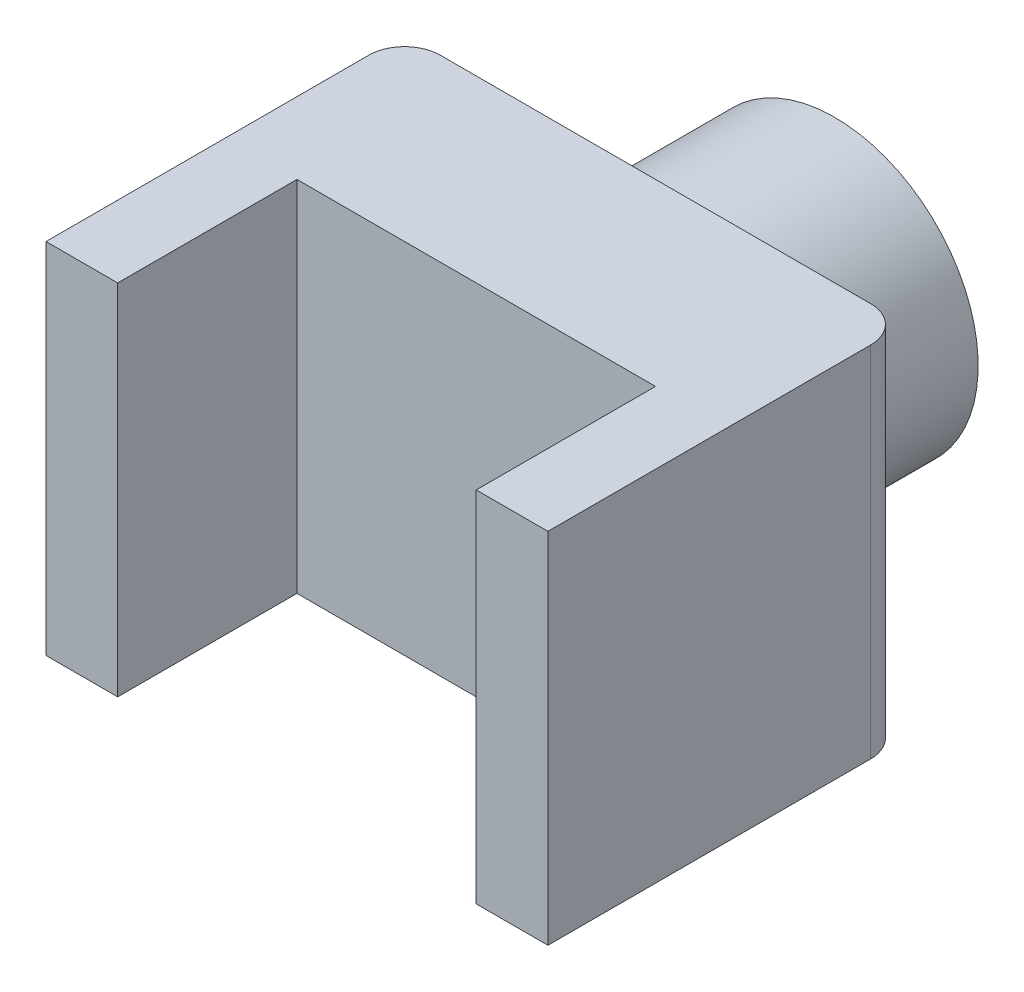
ISO-10303-21;
HEADER;
FILE_DESCRIPTION(('STEP AP214'),'2;1');
FILE_NAME('part.step','',(''),(''),'','','');
FILE_SCHEMA(('AUTOMOTIVE_DESIGN { 1 0 10303 214 1 1 1 1 }'));
ENDSEC;
DATA;
#1=APPLICATION_CONTEXT('core data for automotive mechanical design processes');
#2=APPLICATION_PROTOCOL_DEFINITION('international standard','automotive_design',2000,#1);
#3=PRODUCT_CONTEXT('',#1,'mechanical');
#4=PRODUCT('Part','Part','',(#3));
#5=PRODUCT_RELATED_PRODUCT_CATEGORY('part','',(#4));
#6=PRODUCT_DEFINITION_FORMATION('','',#4);
#7=PRODUCT_DEFINITION_CONTEXT('part definition',#1,'design');
#8=PRODUCT_DEFINITION('design','',#6,#7);
#9=PRODUCT_DEFINITION_SHAPE('','',#8);
#10=(LENGTH_UNIT() NAMED_UNIT(*) SI_UNIT(.MILLI.,.METRE.));
#11=(NAMED_UNIT(*) PLANE_ANGLE_UNIT() SI_UNIT($,.RADIAN.));
#12=(NAMED_UNIT(*) SI_UNIT($,.STERADIAN.) SOLID_ANGLE_UNIT());
#13=UNCERTAINTY_MEASURE_WITH_UNIT(LENGTH_MEASURE(1.E-05),#10,'distance_accuracy_value','');
#14=(GEOMETRIC_REPRESENTATION_CONTEXT(3) GLOBAL_UNCERTAINTY_ASSIGNED_CONTEXT((#13)) GLOBAL_UNIT_ASSIGNED_CONTEXT((#10,
#11,#12)) REPRESENTATION_CONTEXT('',''));
#15=CARTESIAN_POINT('',(0.,0.,0.));
#16=DIRECTION('',(0.,0.,1.));
#17=DIRECTION('',(1.,0.,0.));
#18=AXIS2_PLACEMENT_3D('',#15,#16,#17);
#19=CARTESIAN_POINT('',(0.,0.,10.));
#20=DIRECTION('',(0.,0.,-1.));
#21=DIRECTION('',(-1.,0.,0.));
#22=AXIS2_PLACEMENT_3D('',#19,#20,#21);
#23=PLANE('',#22);
#24=DIRECTION('',(-1.,0.,0.));
#25=VECTOR('',#24,1.);
#26=CARTESIAN_POINT('',(0.,10.,10.));
#27=LINE('',#26,#25);
#28=CARTESIAN_POINT('',(14.,10.,10.));
#29=VERTEX_POINT('',#28);
#30=CARTESIAN_POINT('',(12.,10.,10.));
#31=VERTEX_POINT('',#30);
#32=EDGE_CURVE('E173',#29,#31,#27,.T.);
#33=ORIENTED_EDGE('',*,*,#32,.T.);
#34=DIRECTION('',(0.,1.,0.));
#35=VECTOR('',#34,1.);
#36=CARTESIAN_POINT('',(12.,0.,10.));
#37=LINE('',#36,#35);
#38=CARTESIAN_POINT('',(12.,0.,10.));
#39=VERTEX_POINT('',#38);
#40=EDGE_CURVE('E121',#39,#31,#37,.T.);
#41=ORIENTED_EDGE('',*,*,#40,.F.);
#42=DIRECTION('',(1.,0.,0.));
#43=VECTOR('',#42,1.);
#44=CARTESIAN_POINT('',(0.,0.,10.));
#45=LINE('',#44,#43);
#46=CARTESIAN_POINT('',(14.,0.,10.));
#47=VERTEX_POINT('',#46);
#48=EDGE_CURVE('E165',#39,#47,#45,.T.);
#49=ORIENTED_EDGE('',*,*,#48,.T.);
#50=DIRECTION('',(0.,1.,0.));
#51=VECTOR('',#50,1.);
#52=CARTESIAN_POINT('',(14.,0.,10.));
#53=LINE('',#52,#51);
#54=EDGE_CURVE('E170',#47,#29,#53,.T.);
#55=ORIENTED_EDGE('',*,*,#54,.T.);
#56=EDGE_LOOP('',(#33,#41,#49,#55));
#57=FACE_BOUND('',#56,.T.);
#58=ADVANCED_FACE('F33',(#57),#23,.F.);
#59=CARTESIAN_POINT('',(0.,0.,0.));
#60=DIRECTION('',(0.,0.,-1.));
#61=DIRECTION('',(-1.,0.,0.));
#62=AXIS2_PLACEMENT_3D('',#59,#60,#61);
#63=PLANE('',#62);
#64=DIRECTION('',(-1.,0.,0.));
#65=VECTOR('',#64,1.);
#66=CARTESIAN_POINT('',(0.,10.,0.));
#67=LINE('',#66,#65);
#68=CARTESIAN_POINT('',(13.,10.,0.));
#69=VERTEX_POINT('',#68);
#70=CARTESIAN_POINT('',(7.,10.,0.));
#71=VERTEX_POINT('',#70);
#72=EDGE_CURVE('E166',#69,#71,#67,.T.);
#73=ORIENTED_EDGE('',*,*,#72,.F.);
#74=DIRECTION('',(0.,1.,0.));
#75=VECTOR('',#74,1.);
#76=CARTESIAN_POINT('',(13.,0.,0.));
#77=LINE('',#76,#75);
#78=CARTESIAN_POINT('',(13.,0.,0.));
#79=VERTEX_POINT('',#78);
#80=EDGE_CURVE('E11',#69,#79,#77,.F.);
#81=ORIENTED_EDGE('',*,*,#80,.T.);
#82=DIRECTION('',(1.,0.,0.));
#83=VECTOR('',#82,1.);
#84=CARTESIAN_POINT('',(0.,0.,0.));
#85=LINE('',#84,#83);
#86=CARTESIAN_POINT('',(7.,0.,0.));
#87=VERTEX_POINT('',#86);
#88=EDGE_CURVE('E161',#87,#79,#85,.T.);
#89=ORIENTED_EDGE('',*,*,#88,.F.);
#90=CARTESIAN_POINT('',(7.,5.,0.));
#91=DIRECTION('',(0.,0.,-1.));
#92=DIRECTION('',(-1.,0.,0.));
#93=AXIS2_PLACEMENT_3D('',#90,#91,#92);
#94=CIRCLE('',#93,5.);
#95=EDGE_CURVE('E197',#87,#71,#94,.F.);
#96=ORIENTED_EDGE('',*,*,#95,.T.);
#97=EDGE_LOOP('',(#73,#81,#89,#96));
#98=FACE_BOUND('',#97,.T.);
#99=ADVANCED_FACE('F225',(#98),#63,.T.);
#100=CARTESIAN_POINT('',(0.,0.,10.));
#101=DIRECTION('',(1.,0.,0.));
#102=DIRECTION('',(0.,0.,-1.));
#103=AXIS2_PLACEMENT_3D('',#100,#101,#102);
#104=PLANE('',#103);
#105=DIRECTION('',(0.,0.,-1.));
#106=VECTOR('',#105,1.);
#107=CARTESIAN_POINT('',(0.,10.,10.));
#108=LINE('',#107,#106);
#109=CARTESIAN_POINT('',(0.,10.,10.));
#110=VERTEX_POINT('',#109);
#111=CARTESIAN_POINT('',(0.,10.,0.999999999999999));
#112=VERTEX_POINT('',#111);
#113=EDGE_CURVE('E175',#110,#112,#108,.T.);
#114=ORIENTED_EDGE('',*,*,#113,.T.);
#115=DIRECTION('',(0.,-1.,0.));
#116=VECTOR('',#115,1.);
#117=CARTESIAN_POINT('',(0.,0.,0.999999999999999));
#118=LINE('',#117,#116);
#119=CARTESIAN_POINT('',(0.,0.,0.999999999999999));
#120=VERTEX_POINT('',#119);
#121=EDGE_CURVE('E200',#112,#120,#118,.T.);
#122=ORIENTED_EDGE('',*,*,#121,.T.);
#123=DIRECTION('',(0.,0.,-1.));
#124=VECTOR('',#123,1.);
#125=CARTESIAN_POINT('',(0.,0.,10.));
#126=LINE('',#125,#124);
#127=CARTESIAN_POINT('',(0.,0.,10.));
#128=VERTEX_POINT('',#127);
#129=EDGE_CURVE('E188',#128,#120,#126,.T.);
#130=ORIENTED_EDGE('',*,*,#129,.F.);
#131=DIRECTION('',(0.,-1.,0.));
#132=VECTOR('',#131,1.);
#133=CARTESIAN_POINT('',(0.,0.,10.));
#134=LINE('',#133,#132);
#135=EDGE_CURVE('E162',#110,#128,#134,.T.);
#136=ORIENTED_EDGE('',*,*,#135,.F.);
#137=EDGE_LOOP('',(#114,#122,#130,#136));
#138=FACE_BOUND('',#137,.T.);
#139=ADVANCED_FACE('F244',(#138),#104,.F.);
#140=CARTESIAN_POINT('',(0.,0.,10.));
#141=DIRECTION('',(0.,1.,0.));
#142=DIRECTION('',(0.,0.,1.));
#143=AXIS2_PLACEMENT_3D('',#140,#141,#142);
#144=PLANE('',#143);
#145=ORIENTED_EDGE('',*,*,#48,.F.);
#146=DIRECTION('',(0.,0.,1.));
#147=VECTOR('',#146,1.);
#148=CARTESIAN_POINT('',(12.,0.,5.));
#149=LINE('',#148,#147);
#150=CARTESIAN_POINT('',(12.,0.,5.));
#151=VERTEX_POINT('',#150);
#152=EDGE_CURVE('E146',#151,#39,#149,.T.);
#153=ORIENTED_EDGE('',*,*,#152,.F.);
#154=DIRECTION('',(1.,0.,0.));
#155=VECTOR('',#154,1.);
#156=CARTESIAN_POINT('',(12.,0.,5.));
#157=LINE('',#156,#155);
#158=CARTESIAN_POINT('',(2.,0.,5.));
#159=VERTEX_POINT('',#158);
#160=EDGE_CURVE('E126',#159,#151,#157,.T.);
#161=ORIENTED_EDGE('',*,*,#160,.F.);
#162=DIRECTION('',(0.,0.,1.));
#163=VECTOR('',#162,1.);
#164=CARTESIAN_POINT('',(2.,0.,5.));
#165=LINE('',#164,#163);
#166=CARTESIAN_POINT('',(2.,0.,10.));
#167=VERTEX_POINT('',#166);
#168=EDGE_CURVE('E149',#159,#167,#165,.T.);
#169=ORIENTED_EDGE('',*,*,#168,.T.);
#170=EDGE_CURVE('E167',#128,#167,#45,.T.);
#171=ORIENTED_EDGE('',*,*,#170,.F.);
#172=ORIENTED_EDGE('',*,*,#129,.T.);
#173=CARTESIAN_POINT('',(1.,0.,0.999999999999999));
#174=DIRECTION('',(0.,1.,0.));
#175=DIRECTION('',(0.,0.,1.));
#176=AXIS2_PLACEMENT_3D('',#173,#174,#175);
#177=CIRCLE('',#176,1.);
#178=CARTESIAN_POINT('',(1.,0.,0.));
#179=VERTEX_POINT('',#178);
#180=EDGE_CURVE('E205',#120,#179,#177,.F.);
#181=ORIENTED_EDGE('',*,*,#180,.T.);
#182=EDGE_CURVE('E176',#179,#87,#85,.T.);
#183=ORIENTED_EDGE('',*,*,#182,.T.);
#184=ORIENTED_EDGE('',*,*,#88,.T.);
#185=CARTESIAN_POINT('',(13.,0.,0.999999999999999));
#186=DIRECTION('',(0.,1.,0.));
#187=DIRECTION('',(0.,0.,1.));
#188=AXIS2_PLACEMENT_3D('',#185,#186,#187);
#189=CIRCLE('',#188,1.);
#190=CARTESIAN_POINT('',(14.,0.,0.999999999999999));
#191=VERTEX_POINT('',#190);
#192=EDGE_CURVE('E203',#79,#191,#189,.F.);
#193=ORIENTED_EDGE('',*,*,#192,.T.);
#194=DIRECTION('',(0.,0.,-1.));
#195=VECTOR('',#194,1.);
#196=CARTESIAN_POINT('',(14.,0.,10.));
#197=LINE('',#196,#195);
#198=EDGE_CURVE('E185',#47,#191,#197,.T.);
#199=ORIENTED_EDGE('',*,*,#198,.F.);
#200=EDGE_LOOP('',(#145,#153,#161,#169,#171,#172,#181,#183,#184,#193,#199));
#201=FACE_BOUND('',#200,.T.);
#202=ADVANCED_FACE('F221',(#201),#144,.F.);
#203=CARTESIAN_POINT('',(14.,0.,10.));
#204=DIRECTION('',(-1.,0.,0.));
#205=DIRECTION('',(0.,0.,1.));
#206=AXIS2_PLACEMENT_3D('',#203,#204,#205);
#207=PLANE('',#206);
#208=ORIENTED_EDGE('',*,*,#198,.T.);
#209=DIRECTION('',(0.,1.,0.));
#210=VECTOR('',#209,1.);
#211=CARTESIAN_POINT('',(14.,10.,0.999999999999999));
#212=LINE('',#211,#210);
#213=CARTESIAN_POINT('',(14.,10.,0.999999999999999));
#214=VERTEX_POINT('',#213);
#215=EDGE_CURVE('E41',#191,#214,#212,.T.);
#216=ORIENTED_EDGE('',*,*,#215,.T.);
#217=DIRECTION('',(0.,0.,-1.));
#218=VECTOR('',#217,1.);
#219=CARTESIAN_POINT('',(14.,10.,10.));
#220=LINE('',#219,#218);
#221=EDGE_CURVE('E182',#29,#214,#220,.T.);
#222=ORIENTED_EDGE('',*,*,#221,.F.);
#223=ORIENTED_EDGE('',*,*,#54,.F.);
#224=EDGE_LOOP('',(#208,#216,#222,#223));
#225=FACE_BOUND('',#224,.T.);
#226=ADVANCED_FACE('F213',(#225),#207,.F.);
#227=CARTESIAN_POINT('',(0.,10.,10.));
#228=DIRECTION('',(0.,-1.,0.));
#229=DIRECTION('',(0.,0.,-1.));
#230=AXIS2_PLACEMENT_3D('',#227,#228,#229);
#231=PLANE('',#230);
#232=DIRECTION('',(-1.,0.,0.));
#233=VECTOR('',#232,1.);
#234=CARTESIAN_POINT('',(12.,10.,5.));
#235=LINE('',#234,#233);
#236=CARTESIAN_POINT('',(12.,10.,5.));
#237=VERTEX_POINT('',#236);
#238=CARTESIAN_POINT('',(2.,10.,5.));
#239=VERTEX_POINT('',#238);
#240=EDGE_CURVE('E132',#237,#239,#235,.T.);
#241=ORIENTED_EDGE('',*,*,#240,.F.);
#242=DIRECTION('',(0.,0.,1.));
#243=VECTOR('',#242,1.);
#244=CARTESIAN_POINT('',(12.,10.,5.));
#245=LINE('',#244,#243);
#246=EDGE_CURVE('E115',#237,#31,#245,.T.);
#247=ORIENTED_EDGE('',*,*,#246,.T.);
#248=ORIENTED_EDGE('',*,*,#32,.F.);
#249=ORIENTED_EDGE('',*,*,#221,.T.);
#250=CARTESIAN_POINT('',(13.,10.,0.999999999999999));
#251=DIRECTION('',(0.,-1.,0.));
#252=DIRECTION('',(0.,0.,-1.));
#253=AXIS2_PLACEMENT_3D('',#250,#251,#252);
#254=CIRCLE('',#253,1.);
#255=EDGE_CURVE('E56',#214,#69,#254,.F.);
#256=ORIENTED_EDGE('',*,*,#255,.T.);
#257=ORIENTED_EDGE('',*,*,#72,.T.);
#258=CARTESIAN_POINT('',(1.,10.,0.));
#259=VERTEX_POINT('',#258);
#260=EDGE_CURVE('E178',#71,#259,#67,.T.);
#261=ORIENTED_EDGE('',*,*,#260,.T.);
#262=CARTESIAN_POINT('',(1.,10.,0.999999999999999));
#263=DIRECTION('',(0.,-1.,0.));
#264=DIRECTION('',(0.,0.,-1.));
#265=AXIS2_PLACEMENT_3D('',#262,#263,#264);
#266=CIRCLE('',#265,1.);
#267=EDGE_CURVE('E210',#259,#112,#266,.F.);
#268=ORIENTED_EDGE('',*,*,#267,.T.);
#269=ORIENTED_EDGE('',*,*,#113,.F.);
#270=CARTESIAN_POINT('',(2.,10.,10.));
#271=VERTEX_POINT('',#270);
#272=EDGE_CURVE('E172',#271,#110,#27,.T.);
#273=ORIENTED_EDGE('',*,*,#272,.F.);
#274=DIRECTION('',(0.,0.,1.));
#275=VECTOR('',#274,1.);
#276=CARTESIAN_POINT('',(2.,10.,5.));
#277=LINE('',#276,#275);
#278=EDGE_CURVE('E48',#239,#271,#277,.T.);
#279=ORIENTED_EDGE('',*,*,#278,.F.);
#280=EDGE_LOOP('',(#241,#247,#248,#249,#256,#257,#261,#268,#269,#273,#279));
#281=FACE_BOUND('',#280,.T.);
#282=ADVANCED_FACE('F137',(#281),#231,.F.);
#283=ORIENTED_EDGE('',*,*,#170,.T.);
#284=DIRECTION('',(0.,-1.,0.));
#285=VECTOR('',#284,1.);
#286=CARTESIAN_POINT('',(2.,0.,10.));
#287=LINE('',#286,#285);
#288=EDGE_CURVE('E135',#271,#167,#287,.T.);
#289=ORIENTED_EDGE('',*,*,#288,.F.);
#290=ORIENTED_EDGE('',*,*,#272,.T.);
#291=ORIENTED_EDGE('',*,*,#135,.T.);
#292=EDGE_LOOP('',(#283,#289,#290,#291));
#293=FACE_BOUND('',#292,.T.);
#294=ADVANCED_FACE('F247',(#293),#23,.F.);
#295=ORIENTED_EDGE('',*,*,#182,.F.);
#296=DIRECTION('',(0.,-1.,0.));
#297=VECTOR('',#296,1.);
#298=CARTESIAN_POINT('',(1.,10.,0.));
#299=LINE('',#298,#297);
#300=EDGE_CURVE('E207',#179,#259,#299,.F.);
#301=ORIENTED_EDGE('',*,*,#300,.T.);
#302=ORIENTED_EDGE('',*,*,#260,.F.);
#303=CARTESIAN_POINT('',(7.,5.,0.));
#304=DIRECTION('',(0.,0.,-1.));
#305=DIRECTION('',(-1.,0.,0.));
#306=AXIS2_PLACEMENT_3D('',#303,#304,#305);
#307=CIRCLE('',#306,5.);
#308=EDGE_CURVE('E194',#71,#87,#307,.F.);
#309=ORIENTED_EDGE('',*,*,#308,.T.);
#310=EDGE_LOOP('',(#295,#301,#302,#309));
#311=FACE_BOUND('',#310,.T.);
#312=ADVANCED_FACE('F236',(#311),#63,.T.);
#313=CARTESIAN_POINT('',(7.,5.,-5.));
#314=DIRECTION('',(0.,0.,1.));
#315=DIRECTION('',(1.,0.,0.));
#316=AXIS2_PLACEMENT_3D('',#313,#314,#315);
#317=CYLINDRICAL_SURFACE('',#316,4.);
#318=CARTESIAN_POINT('',(7.,5.,-1.));
#319=DIRECTION('',(0.,0.,-1.));
#320=DIRECTION('',(-1.,0.,0.));
#321=AXIS2_PLACEMENT_3D('',#318,#319,#320);
#322=CIRCLE('',#321,4.);
#323=CARTESIAN_POINT('',(3.,5.,-1.));
#324=VERTEX_POINT('',#323);
#325=EDGE_CURVE('E191',#324,#324,#322,.T.);
#326=ORIENTED_EDGE('',*,*,#325,.T.);
#327=EDGE_LOOP('',(#326));
#328=FACE_BOUND('',#327,.T.);
#329=CARTESIAN_POINT('',(7.,5.,-5.));
#330=DIRECTION('',(0.,0.,-1.));
#331=DIRECTION('',(-1.,0.,0.));
#332=AXIS2_PLACEMENT_3D('',#329,#330,#331);
#333=CIRCLE('',#332,4.);
#334=CARTESIAN_POINT('',(3.,5.,-5.));
#335=VERTEX_POINT('',#334);
#336=EDGE_CURVE('E156',#335,#335,#333,.T.);
#337=ORIENTED_EDGE('',*,*,#336,.F.);
#338=EDGE_LOOP('',(#337));
#339=FACE_BOUND('',#338,.T.);
#340=ADVANCED_FACE('F269',(#328,#339),#317,.T.);
#341=CARTESIAN_POINT('',(7.,5.,-5.));
#342=DIRECTION('',(0.,0.,-1.));
#343=DIRECTION('',(-1.,0.,0.));
#344=AXIS2_PLACEMENT_3D('',#341,#342,#343);
#345=PLANE('',#344);
#346=CARTESIAN_POINT('',(7.,5.,-5.));
#347=DIRECTION('',(0.,0.,-1.));
#348=DIRECTION('',(-1.,0.,0.));
#349=AXIS2_PLACEMENT_3D('',#346,#347,#348);
#350=CIRCLE('',#349,2.5);
#351=CARTESIAN_POINT('',(4.5,5.,-5.));
#352=VERTEX_POINT('',#351);
#353=EDGE_CURVE('E148',#352,#352,#350,.T.);
#354=ORIENTED_EDGE('',*,*,#353,.F.);
#355=EDGE_LOOP('',(#354));
#356=FACE_BOUND('',#355,.T.);
#357=ORIENTED_EDGE('',*,*,#336,.T.);
#358=EDGE_LOOP('',(#357));
#359=FACE_BOUND('',#358,.T.);
#360=ADVANCED_FACE('F361',(#356,#359),#345,.T.);
#361=CARTESIAN_POINT('',(7.,5.,0.));
#362=DIRECTION('',(0.,0.,-1.));
#363=DIRECTION('',(-1.,0.,0.));
#364=AXIS2_PLACEMENT_3D('',#361,#362,#363);
#365=CYLINDRICAL_SURFACE('',#364,2.5);
#366=CARTESIAN_POINT('',(7.,5.,0.));
#367=DIRECTION('',(0.,0.,-1.));
#368=DIRECTION('',(-1.,0.,0.));
#369=AXIS2_PLACEMENT_3D('',#366,#367,#368);
#370=CIRCLE('',#369,2.5);
#371=CARTESIAN_POINT('',(4.5,5.,0.));
#372=VERTEX_POINT('',#371);
#373=EDGE_CURVE('E153',#372,#372,#370,.T.);
#374=ORIENTED_EDGE('',*,*,#373,.F.);
#375=EDGE_LOOP('',(#374));
#376=FACE_BOUND('',#375,.T.);
#377=ORIENTED_EDGE('',*,*,#353,.T.);
#378=EDGE_LOOP('',(#377));
#379=FACE_BOUND('',#378,.T.);
#380=ADVANCED_FACE('F352',(#376,#379),#365,.F.);
#381=CARTESIAN_POINT('',(7.,5.,0.));
#382=DIRECTION('',(0.,0.,-1.));
#383=DIRECTION('',(-1.,0.,0.));
#384=AXIS2_PLACEMENT_3D('',#381,#382,#383);
#385=PLANE('',#384);
#386=ORIENTED_EDGE('',*,*,#373,.T.);
#387=EDGE_LOOP('',(#386));
#388=FACE_BOUND('',#387,.T.);
#389=ADVANCED_FACE('F281',(#388),#385,.T.);
#390=CARTESIAN_POINT('',(7.,5.,-1.));
#391=DIRECTION('',(0.,0.,-1.));
#392=DIRECTION('',(-1.,0.,0.));
#393=AXIS2_PLACEMENT_3D('',#390,#391,#392);
#394=TOROIDAL_SURFACE('',#393,5.,1.);
#395=ORIENTED_EDGE('',*,*,#308,.F.);
#396=ORIENTED_EDGE('',*,*,#95,.F.);
#397=EDGE_LOOP('',(#395,#396));
#398=FACE_BOUND('',#397,.T.);
#399=ORIENTED_EDGE('',*,*,#325,.F.);
#400=EDGE_LOOP('',(#399));
#401=FACE_BOUND('',#400,.T.);
#402=ADVANCED_FACE('F232',(#398,#401),#394,.F.);
#403=CARTESIAN_POINT('',(1.,0.,0.999999999999999));
#404=DIRECTION('',(0.,1.,0.));
#405=DIRECTION('',(0.,0.,1.));
#406=AXIS2_PLACEMENT_3D('',#403,#404,#405);
#407=CYLINDRICAL_SURFACE('',#406,1.);
#408=ORIENTED_EDGE('',*,*,#267,.F.);
#409=ORIENTED_EDGE('',*,*,#300,.F.);
#410=ORIENTED_EDGE('',*,*,#180,.F.);
#411=ORIENTED_EDGE('',*,*,#121,.F.);
#412=EDGE_LOOP('',(#408,#409,#410,#411));
#413=FACE_BOUND('',#412,.T.);
#414=ADVANCED_FACE('F239',(#413),#407,.T.);
#415=CARTESIAN_POINT('',(13.,0.,0.999999999999999));
#416=DIRECTION('',(0.,-1.,0.));
#417=DIRECTION('',(0.,0.,-1.));
#418=AXIS2_PLACEMENT_3D('',#415,#416,#417);
#419=CYLINDRICAL_SURFACE('',#418,1.);
#420=ORIENTED_EDGE('',*,*,#192,.F.);
#421=ORIENTED_EDGE('',*,*,#80,.F.);
#422=ORIENTED_EDGE('',*,*,#255,.F.);
#423=ORIENTED_EDGE('',*,*,#215,.F.);
#424=EDGE_LOOP('',(#420,#421,#422,#423));
#425=FACE_BOUND('',#424,.T.);
#426=ADVANCED_FACE('F35',(#425),#419,.T.);
#427=CARTESIAN_POINT('',(12.,0.,5.));
#428=DIRECTION('',(1.,0.,0.));
#429=DIRECTION('',(0.,0.,-1.));
#430=AXIS2_PLACEMENT_3D('',#427,#428,#429);
#431=PLANE('',#430);
#432=ORIENTED_EDGE('',*,*,#40,.T.);
#433=ORIENTED_EDGE('',*,*,#246,.F.);
#434=DIRECTION('',(0.,1.,0.));
#435=VECTOR('',#434,1.);
#436=CARTESIAN_POINT('',(12.,0.,5.));
#437=LINE('',#436,#435);
#438=EDGE_CURVE('E118',#151,#237,#437,.T.);
#439=ORIENTED_EDGE('',*,*,#438,.F.);
#440=ORIENTED_EDGE('',*,*,#152,.T.);
#441=EDGE_LOOP('',(#432,#433,#439,#440));
#442=FACE_BOUND('',#441,.T.);
#443=ADVANCED_FACE('F117',(#442),#431,.F.);
#444=CARTESIAN_POINT('',(2.,0.,5.));
#445=DIRECTION('',(-1.,0.,0.));
#446=DIRECTION('',(0.,0.,1.));
#447=AXIS2_PLACEMENT_3D('',#444,#445,#446);
#448=PLANE('',#447);
#449=ORIENTED_EDGE('',*,*,#288,.T.);
#450=ORIENTED_EDGE('',*,*,#168,.F.);
#451=DIRECTION('',(0.,-1.,0.));
#452=VECTOR('',#451,1.);
#453=CARTESIAN_POINT('',(2.,0.,5.));
#454=LINE('',#453,#452);
#455=EDGE_CURVE('E139',#239,#159,#454,.T.);
#456=ORIENTED_EDGE('',*,*,#455,.F.);
#457=ORIENTED_EDGE('',*,*,#278,.T.);
#458=EDGE_LOOP('',(#449,#450,#456,#457));
#459=FACE_BOUND('',#458,.T.);
#460=ADVANCED_FACE('F248',(#459),#448,.F.);
#461=CARTESIAN_POINT('',(0.,0.,5.));
#462=DIRECTION('',(0.,0.,1.));
#463=DIRECTION('',(1.,0.,0.));
#464=AXIS2_PLACEMENT_3D('',#461,#462,#463);
#465=PLANE('',#464);
#466=ORIENTED_EDGE('',*,*,#438,.T.);
#467=ORIENTED_EDGE('',*,*,#240,.T.);
#468=ORIENTED_EDGE('',*,*,#455,.T.);
#469=ORIENTED_EDGE('',*,*,#160,.T.);
#470=EDGE_LOOP('',(#466,#467,#468,#469));
#471=FACE_BOUND('',#470,.T.);
#472=ADVANCED_FACE('F130',(#471),#465,.T.);
#473=CLOSED_SHELL('',(#58,#99,#139,#202,#226,#282,#294,#312,#340,#360,#380,#389,#402,#414,#426,
#443,#460,#472));
#474=MANIFOLD_SOLID_BREP('B2',#473);
#475=ADVANCED_BREP_SHAPE_REPRESENTATION('',(#18,#474),#14);
#476=SHAPE_DEFINITION_REPRESENTATION(#9,#475);
ENDSEC;
END-ISO-10303-21;
